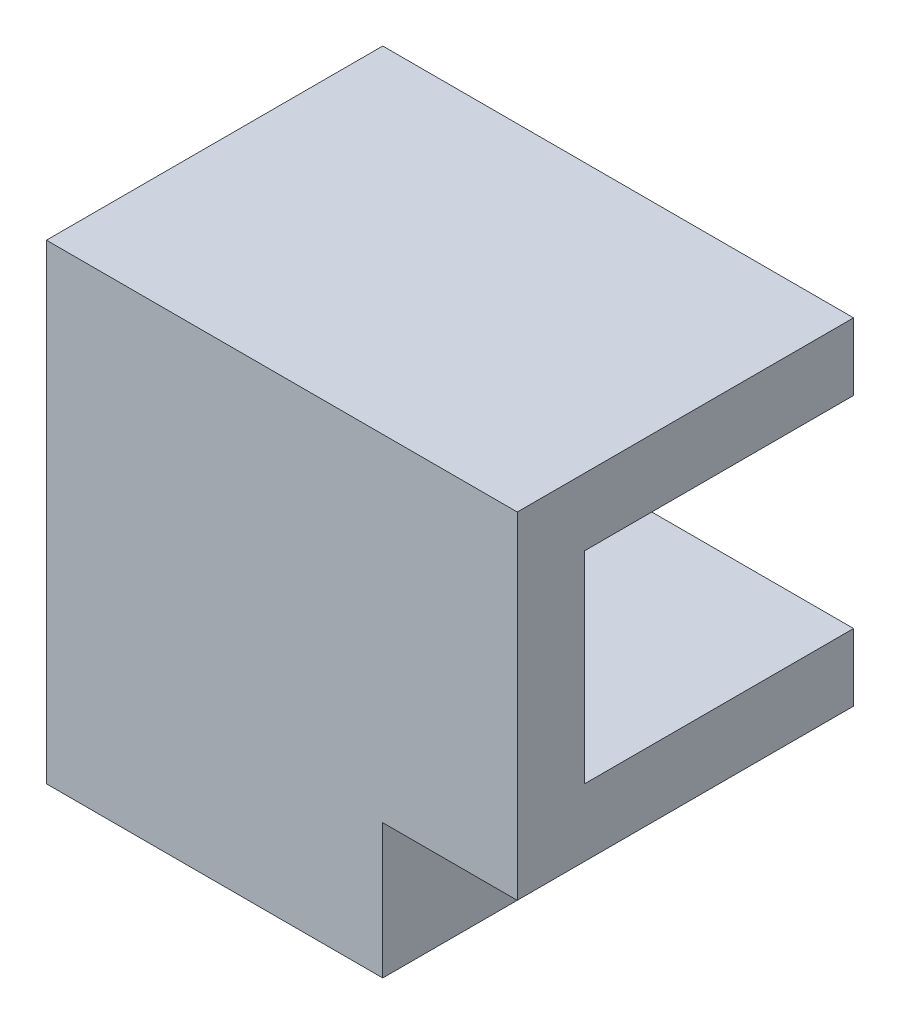
ISO-10303-21;
HEADER;
FILE_DESCRIPTION(('STEP AP214'),'2;1');
FILE_NAME('part.step','',(''),(''),'','','');
FILE_SCHEMA(('AUTOMOTIVE_DESIGN { 1 0 10303 214 1 1 1 1 }'));
ENDSEC;
DATA;
#1=APPLICATION_CONTEXT('core data for automotive mechanical design processes');
#2=APPLICATION_PROTOCOL_DEFINITION('international standard','automotive_design',2000,#1);
#3=PRODUCT_CONTEXT('',#1,'mechanical');
#4=PRODUCT('Part','Part','',(#3));
#5=PRODUCT_RELATED_PRODUCT_CATEGORY('part','',(#4));
#6=PRODUCT_DEFINITION_FORMATION('','',#4);
#7=PRODUCT_DEFINITION_CONTEXT('part definition',#1,'design');
#8=PRODUCT_DEFINITION('design','',#6,#7);
#9=PRODUCT_DEFINITION_SHAPE('','',#8);
#10=(LENGTH_UNIT() NAMED_UNIT(*) SI_UNIT(.MILLI.,.METRE.));
#11=(NAMED_UNIT(*) PLANE_ANGLE_UNIT() SI_UNIT($,.RADIAN.));
#12=(NAMED_UNIT(*) SI_UNIT($,.STERADIAN.) SOLID_ANGLE_UNIT());
#13=UNCERTAINTY_MEASURE_WITH_UNIT(LENGTH_MEASURE(1.E-05),#10,'distance_accuracy_value','');
#14=(GEOMETRIC_REPRESENTATION_CONTEXT(3) GLOBAL_UNCERTAINTY_ASSIGNED_CONTEXT((#13)) GLOBAL_UNIT_ASSIGNED_CONTEXT((#10,
#11,#12)) REPRESENTATION_CONTEXT('',''));
#15=CARTESIAN_POINT('',(0.,0.,0.));
#16=DIRECTION('',(0.,0.,1.));
#17=DIRECTION('',(1.,0.,0.));
#18=AXIS2_PLACEMENT_3D('',#15,#16,#17);
#19=CARTESIAN_POINT('',(0.,0.,0.));
#20=DIRECTION('',(0.,0.,1.));
#21=DIRECTION('',(1.,0.,0.));
#22=AXIS2_PLACEMENT_3D('',#19,#20,#21);
#23=PLANE('',#22);
#24=DIRECTION('',(0.,-1.,0.));
#25=VECTOR('',#24,1.);
#26=CARTESIAN_POINT('',(-2.317889251264,1.36643026004728,0.));
#27=LINE('',#26,#25);
#28=CARTESIAN_POINT('',(-2.317889251264,-1.63356973995272,0.));
#29=VERTEX_POINT('',#28);
#30=CARTESIAN_POINT('',(-2.317889251264,-4.63356973995272,0.));
#31=VERTEX_POINT('',#30);
#32=EDGE_CURVE('E174',#29,#31,#27,.T.);
#33=ORIENTED_EDGE('',*,*,#32,.F.);
#34=DIRECTION('',(1.,0.,0.));
#35=VECTOR('',#34,1.);
#36=CARTESIAN_POINT('',(-5.317889251264,-1.63356973995272,0.));
#37=LINE('',#36,#35);
#38=CARTESIAN_POINT('',(0.682110748736001,-1.63356973995272,0.));
#39=VERTEX_POINT('',#38);
#40=EDGE_CURVE('E184',#29,#39,#37,.T.);
#41=ORIENTED_EDGE('',*,*,#40,.T.);
#42=DIRECTION('',(0.,1.,0.));
#43=VECTOR('',#42,1.);
#44=CARTESIAN_POINT('',(0.682110748736001,2.36643026004728,0.));
#45=LINE('',#44,#43);
#46=CARTESIAN_POINT('',(0.682110748736002,-2.63356973995272,0.));
#47=VERTEX_POINT('',#46);
#48=EDGE_CURVE('E146',#47,#39,#45,.T.);
#49=ORIENTED_EDGE('',*,*,#48,.F.);
#50=DIRECTION('',(1.,0.,0.));
#51=VECTOR('',#50,1.);
#52=CARTESIAN_POINT('',(-1.317889251264,-2.63356973995272,0.));
#53=LINE('',#52,#51);
#54=CARTESIAN_POINT('',(-1.317889251264,-2.63356973995272,0.));
#55=VERTEX_POINT('',#54);
#56=EDGE_CURVE('E121',#55,#47,#53,.T.);
#57=ORIENTED_EDGE('',*,*,#56,.F.);
#58=DIRECTION('',(0.,1.,0.));
#59=VECTOR('',#58,1.);
#60=CARTESIAN_POINT('',(-1.317889251264,-4.63356973995272,0.));
#61=LINE('',#60,#59);
#62=CARTESIAN_POINT('',(-1.317889251264,-4.63356973995272,0.));
#63=VERTEX_POINT('',#62);
#64=EDGE_CURVE('E142',#63,#55,#61,.T.);
#65=ORIENTED_EDGE('',*,*,#64,.F.);
#66=DIRECTION('',(1.,0.,0.));
#67=VECTOR('',#66,1.);
#68=CARTESIAN_POINT('',(-6.317889251264,-4.63356973995272,0.));
#69=LINE('',#68,#67);
#70=EDGE_CURVE('E137',#31,#63,#69,.T.);
#71=ORIENTED_EDGE('',*,*,#70,.F.);
#72=EDGE_LOOP('',(#33,#41,#49,#57,#65,#71));
#73=FACE_BOUND('',#72,.T.);
#74=ADVANCED_FACE('F35',(#73),#23,.F.);
#75=CARTESIAN_POINT('',(-6.317889251264,2.36643026004728,5.));
#76=DIRECTION('',(1.,0.,0.));
#77=DIRECTION('',(0.,1.,0.));
#78=AXIS2_PLACEMENT_3D('',#75,#76,#77);
#79=PLANE('',#78);
#80=DIRECTION('',(0.,-1.,0.));
#81=VECTOR('',#80,1.);
#82=CARTESIAN_POINT('',(-6.317889251264,2.36643026004728,0.));
#83=LINE('',#82,#81);
#84=CARTESIAN_POINT('',(-6.317889251264,2.36643026004728,0.));
#85=VERTEX_POINT('',#84);
#86=CARTESIAN_POINT('',(-6.317889251264,-4.63356973995272,0.));
#87=VERTEX_POINT('',#86);
#88=EDGE_CURVE('E134',#85,#87,#83,.T.);
#89=ORIENTED_EDGE('',*,*,#88,.T.);
#90=DIRECTION('',(0.,0.,-1.));
#91=VECTOR('',#90,1.);
#92=CARTESIAN_POINT('',(-6.317889251264,-4.63356973995272,5.));
#93=LINE('',#92,#91);
#94=CARTESIAN_POINT('',(-6.317889251264,-4.63356973995272,5.));
#95=VERTEX_POINT('',#94);
#96=EDGE_CURVE('E43',#95,#87,#93,.T.);
#97=ORIENTED_EDGE('',*,*,#96,.F.);
#98=DIRECTION('',(0.,-1.,0.));
#99=VECTOR('',#98,1.);
#100=CARTESIAN_POINT('',(-6.317889251264,2.36643026004728,5.));
#101=LINE('',#100,#99);
#102=CARTESIAN_POINT('',(-6.317889251264,2.36643026004728,5.));
#103=VERTEX_POINT('',#102);
#104=EDGE_CURVE('E149',#103,#95,#101,.T.);
#105=ORIENTED_EDGE('',*,*,#104,.F.);
#106=DIRECTION('',(0.,0.,-1.));
#107=VECTOR('',#106,1.);
#108=CARTESIAN_POINT('',(-6.317889251264,2.36643026004728,5.));
#109=LINE('',#108,#107);
#110=EDGE_CURVE('E130',#103,#85,#109,.T.);
#111=ORIENTED_EDGE('',*,*,#110,.T.);
#112=EDGE_LOOP('',(#89,#97,#105,#111));
#113=FACE_BOUND('',#112,.T.);
#114=ADVANCED_FACE('F37',(#113),#79,.F.);
#115=CARTESIAN_POINT('',(-6.317889251264,-4.63356973995272,5.));
#116=DIRECTION('',(0.,1.,0.));
#117=DIRECTION('',(0.,0.,1.));
#118=AXIS2_PLACEMENT_3D('',#115,#116,#117);
#119=PLANE('',#118);
#120=CARTESIAN_POINT('',(-5.317889251264,-4.63356973995272,0.));
#121=VERTEX_POINT('',#120);
#122=EDGE_CURVE('E139',#87,#121,#69,.T.);
#123=ORIENTED_EDGE('',*,*,#122,.T.);
#124=DIRECTION('',(0.,0.,-1.));
#125=VECTOR('',#124,1.);
#126=CARTESIAN_POINT('',(-5.317889251264,-4.63356973995272,0.));
#127=LINE('',#126,#125);
#128=CARTESIAN_POINT('',(-5.317889251264,-4.63356973995272,4.));
#129=VERTEX_POINT('',#128);
#130=EDGE_CURVE('E178',#129,#121,#127,.T.);
#131=ORIENTED_EDGE('',*,*,#130,.F.);
#132=DIRECTION('',(-1.,0.,0.));
#133=VECTOR('',#132,1.);
#134=CARTESIAN_POINT('',(-5.317889251264,-4.63356973995272,4.));
#135=LINE('',#134,#133);
#136=CARTESIAN_POINT('',(-2.317889251264,-4.63356973995272,4.));
#137=VERTEX_POINT('',#136);
#138=EDGE_CURVE('E187',#137,#129,#135,.T.);
#139=ORIENTED_EDGE('',*,*,#138,.F.);
#140=DIRECTION('',(0.,0.,1.));
#141=VECTOR('',#140,1.);
#142=CARTESIAN_POINT('',(-2.317889251264,-4.63356973995272,0.));
#143=LINE('',#142,#141);
#144=EDGE_CURVE('E183',#31,#137,#143,.T.);
#145=ORIENTED_EDGE('',*,*,#144,.F.);
#146=ORIENTED_EDGE('',*,*,#70,.T.);
#147=DIRECTION('',(0.,0.,-1.));
#148=VECTOR('',#147,1.);
#149=CARTESIAN_POINT('',(-1.317889251264,-4.63356973995272,5.));
#150=LINE('',#149,#148);
#151=CARTESIAN_POINT('',(-1.317889251264,-4.63356973995272,5.));
#152=VERTEX_POINT('',#151);
#153=EDGE_CURVE('E153',#152,#63,#150,.T.);
#154=ORIENTED_EDGE('',*,*,#153,.F.);
#155=DIRECTION('',(1.,0.,0.));
#156=VECTOR('',#155,1.);
#157=CARTESIAN_POINT('',(-6.317889251264,-4.63356973995272,5.));
#158=LINE('',#157,#156);
#159=EDGE_CURVE('E95',#95,#152,#158,.T.);
#160=ORIENTED_EDGE('',*,*,#159,.F.);
#161=ORIENTED_EDGE('',*,*,#96,.T.);
#162=EDGE_LOOP('',(#123,#131,#139,#145,#146,#154,#160,#161));
#163=FACE_BOUND('',#162,.T.);
#164=ADVANCED_FACE('F156',(#163),#119,.F.);
#165=CARTESIAN_POINT('',(-1.317889251264,-4.63356973995272,5.));
#166=DIRECTION('',(-1.,0.,0.));
#167=DIRECTION('',(0.,0.,1.));
#168=AXIS2_PLACEMENT_3D('',#165,#166,#167);
#169=PLANE('',#168);
#170=ORIENTED_EDGE('',*,*,#64,.T.);
#171=DIRECTION('',(0.,0.,-1.));
#172=VECTOR('',#171,1.);
#173=CARTESIAN_POINT('',(-1.317889251264,-2.63356973995272,5.));
#174=LINE('',#173,#172);
#175=CARTESIAN_POINT('',(-1.317889251264,-2.63356973995272,5.));
#176=VERTEX_POINT('',#175);
#177=EDGE_CURVE('E125',#176,#55,#174,.T.);
#178=ORIENTED_EDGE('',*,*,#177,.F.);
#179=DIRECTION('',(0.,1.,0.));
#180=VECTOR('',#179,1.);
#181=CARTESIAN_POINT('',(-1.317889251264,-4.63356973995272,5.));
#182=LINE('',#181,#180);
#183=EDGE_CURVE('E112',#152,#176,#182,.T.);
#184=ORIENTED_EDGE('',*,*,#183,.F.);
#185=ORIENTED_EDGE('',*,*,#153,.T.);
#186=EDGE_LOOP('',(#170,#178,#184,#185));
#187=FACE_BOUND('',#186,.T.);
#188=ADVANCED_FACE('F207',(#187),#169,.F.);
#189=CARTESIAN_POINT('',(-1.317889251264,-2.63356973995272,5.));
#190=DIRECTION('',(0.,1.,0.));
#191=DIRECTION('',(0.,0.,1.));
#192=AXIS2_PLACEMENT_3D('',#189,#190,#191);
#193=PLANE('',#192);
#194=ORIENTED_EDGE('',*,*,#56,.T.);
#195=DIRECTION('',(0.,0.,-1.));
#196=VECTOR('',#195,1.);
#197=CARTESIAN_POINT('',(0.682110748736002,-2.63356973995272,5.));
#198=LINE('',#197,#196);
#199=CARTESIAN_POINT('',(0.682110748736002,-2.63356973995272,5.));
#200=VERTEX_POINT('',#199);
#201=EDGE_CURVE('E118',#200,#47,#198,.T.);
#202=ORIENTED_EDGE('',*,*,#201,.F.);
#203=DIRECTION('',(1.,0.,0.));
#204=VECTOR('',#203,1.);
#205=CARTESIAN_POINT('',(-1.317889251264,-2.63356973995272,5.));
#206=LINE('',#205,#204);
#207=EDGE_CURVE('E105',#176,#200,#206,.T.);
#208=ORIENTED_EDGE('',*,*,#207,.F.);
#209=ORIENTED_EDGE('',*,*,#177,.T.);
#210=EDGE_LOOP('',(#194,#202,#208,#209));
#211=FACE_BOUND('',#210,.T.);
#212=ADVANCED_FACE('F119',(#211),#193,.F.);
#213=CARTESIAN_POINT('',(0.682110748736001,2.36643026004728,5.));
#214=DIRECTION('',(-1.,0.,0.));
#215=DIRECTION('',(0.,-1.,0.));
#216=AXIS2_PLACEMENT_3D('',#213,#214,#215);
#217=PLANE('',#216);
#218=ORIENTED_EDGE('',*,*,#48,.T.);
#219=DIRECTION('',(0.,0.,-1.));
#220=VECTOR('',#219,1.);
#221=CARTESIAN_POINT('',(0.682110748736001,-1.63356973995272,0.));
#222=LINE('',#221,#220);
#223=CARTESIAN_POINT('',(0.682110748736001,-1.63356973995272,4.));
#224=VERTEX_POINT('',#223);
#225=EDGE_CURVE('E216',#224,#39,#222,.T.);
#226=ORIENTED_EDGE('',*,*,#225,.F.);
#227=DIRECTION('',(0.,-1.,0.));
#228=VECTOR('',#227,1.);
#229=CARTESIAN_POINT('',(0.682110748736001,1.36643026004728,4.));
#230=LINE('',#229,#228);
#231=CARTESIAN_POINT('',(0.682110748736001,1.36643026004728,4.));
#232=VERTEX_POINT('',#231);
#233=EDGE_CURVE('E240',#232,#224,#230,.T.);
#234=ORIENTED_EDGE('',*,*,#233,.F.);
#235=DIRECTION('',(0.,0.,1.));
#236=VECTOR('',#235,1.);
#237=CARTESIAN_POINT('',(0.682110748736001,1.36643026004728,0.));
#238=LINE('',#237,#236);
#239=CARTESIAN_POINT('',(0.682110748736001,1.36643026004728,0.));
#240=VERTEX_POINT('',#239);
#241=EDGE_CURVE('E243',#240,#232,#238,.T.);
#242=ORIENTED_EDGE('',*,*,#241,.F.);
#243=CARTESIAN_POINT('',(0.682110748736001,2.36643026004728,0.));
#244=VERTEX_POINT('',#243);
#245=EDGE_CURVE('E145',#240,#244,#45,.T.);
#246=ORIENTED_EDGE('',*,*,#245,.T.);
#247=DIRECTION('',(0.,0.,-1.));
#248=VECTOR('',#247,1.);
#249=CARTESIAN_POINT('',(0.682110748736001,2.36643026004728,5.));
#250=LINE('',#249,#248);
#251=CARTESIAN_POINT('',(0.682110748736001,2.36643026004728,5.));
#252=VERTEX_POINT('',#251);
#253=EDGE_CURVE('E126',#252,#244,#250,.T.);
#254=ORIENTED_EDGE('',*,*,#253,.F.);
#255=DIRECTION('',(0.,1.,0.));
#256=VECTOR('',#255,1.);
#257=CARTESIAN_POINT('',(0.682110748736001,2.36643026004728,5.));
#258=LINE('',#257,#256);
#259=EDGE_CURVE('E109',#200,#252,#258,.T.);
#260=ORIENTED_EDGE('',*,*,#259,.F.);
#261=ORIENTED_EDGE('',*,*,#201,.T.);
#262=EDGE_LOOP('',(#218,#226,#234,#242,#246,#254,#260,#261));
#263=FACE_BOUND('',#262,.T.);
#264=ADVANCED_FACE('F128',(#263),#217,.F.);
#265=CARTESIAN_POINT('',(-6.317889251264,2.36643026004728,5.));
#266=DIRECTION('',(0.,-1.,0.));
#267=DIRECTION('',(1.,0.,0.));
#268=AXIS2_PLACEMENT_3D('',#265,#266,#267);
#269=PLANE('',#268);
#270=DIRECTION('',(-1.,0.,0.));
#271=VECTOR('',#270,1.);
#272=CARTESIAN_POINT('',(-6.317889251264,2.36643026004728,0.));
#273=LINE('',#272,#271);
#274=EDGE_CURVE('E86',#244,#85,#273,.T.);
#275=ORIENTED_EDGE('',*,*,#274,.T.);
#276=ORIENTED_EDGE('',*,*,#110,.F.);
#277=DIRECTION('',(-1.,0.,0.));
#278=VECTOR('',#277,1.);
#279=CARTESIAN_POINT('',(-6.317889251264,2.36643026004728,5.));
#280=LINE('',#279,#278);
#281=EDGE_CURVE('E59',#252,#103,#280,.T.);
#282=ORIENTED_EDGE('',*,*,#281,.F.);
#283=ORIENTED_EDGE('',*,*,#253,.T.);
#284=EDGE_LOOP('',(#275,#276,#282,#283));
#285=FACE_BOUND('',#284,.T.);
#286=ADVANCED_FACE('F251',(#285),#269,.F.);
#287=CARTESIAN_POINT('',(0.,0.,5.));
#288=DIRECTION('',(0.,0.,1.));
#289=DIRECTION('',(1.,0.,0.));
#290=AXIS2_PLACEMENT_3D('',#287,#288,#289);
#291=PLANE('',#290);
#292=ORIENTED_EDGE('',*,*,#104,.T.);
#293=ORIENTED_EDGE('',*,*,#159,.T.);
#294=ORIENTED_EDGE('',*,*,#183,.T.);
#295=ORIENTED_EDGE('',*,*,#207,.T.);
#296=ORIENTED_EDGE('',*,*,#259,.T.);
#297=ORIENTED_EDGE('',*,*,#281,.T.);
#298=EDGE_LOOP('',(#292,#293,#294,#295,#296,#297));
#299=FACE_BOUND('',#298,.T.);
#300=ADVANCED_FACE('F107',(#299),#291,.T.);
#301=ORIENTED_EDGE('',*,*,#245,.F.);
#302=DIRECTION('',(1.,0.,0.));
#303=VECTOR('',#302,1.);
#304=CARTESIAN_POINT('',(-5.317889251264,1.36643026004728,0.));
#305=LINE('',#304,#303);
#306=CARTESIAN_POINT('',(-5.317889251264,1.36643026004728,0.));
#307=VERTEX_POINT('',#306);
#308=EDGE_CURVE('E169',#307,#240,#305,.T.);
#309=ORIENTED_EDGE('',*,*,#308,.F.);
#310=DIRECTION('',(0.,-1.,0.));
#311=VECTOR('',#310,1.);
#312=CARTESIAN_POINT('',(-5.317889251264,1.36643026004728,0.));
#313=LINE('',#312,#311);
#314=EDGE_CURVE('E167',#307,#121,#313,.T.);
#315=ORIENTED_EDGE('',*,*,#314,.T.);
#316=ORIENTED_EDGE('',*,*,#122,.F.);
#317=ORIENTED_EDGE('',*,*,#88,.F.);
#318=ORIENTED_EDGE('',*,*,#274,.F.);
#319=EDGE_LOOP('',(#301,#309,#315,#316,#317,#318));
#320=FACE_BOUND('',#319,.T.);
#321=ADVANCED_FACE('F164',(#320),#23,.F.);
#322=CARTESIAN_POINT('',(-5.317889251264,1.36643026004728,0.));
#323=DIRECTION('',(-1.,0.,0.));
#324=DIRECTION('',(0.,0.,1.));
#325=AXIS2_PLACEMENT_3D('',#322,#323,#324);
#326=PLANE('',#325);
#327=ORIENTED_EDGE('',*,*,#130,.T.);
#328=ORIENTED_EDGE('',*,*,#314,.F.);
#329=DIRECTION('',(0.,0.,-1.));
#330=VECTOR('',#329,1.);
#331=CARTESIAN_POINT('',(-5.317889251264,1.36643026004728,0.));
#332=LINE('',#331,#330);
#333=CARTESIAN_POINT('',(-5.317889251264,1.36643026004728,4.));
#334=VERTEX_POINT('',#333);
#335=EDGE_CURVE('E50',#334,#307,#332,.T.);
#336=ORIENTED_EDGE('',*,*,#335,.F.);
#337=DIRECTION('',(0.,-1.,0.));
#338=VECTOR('',#337,1.);
#339=CARTESIAN_POINT('',(-5.317889251264,1.36643026004728,4.));
#340=LINE('',#339,#338);
#341=EDGE_CURVE('E138',#334,#129,#340,.T.);
#342=ORIENTED_EDGE('',*,*,#341,.T.);
#343=EDGE_LOOP('',(#327,#328,#336,#342));
#344=FACE_BOUND('',#343,.T.);
#345=ADVANCED_FACE('F179',(#344),#326,.F.);
#346=CARTESIAN_POINT('',(-5.317889251264,1.36643026004728,4.));
#347=DIRECTION('',(0.,0.,1.));
#348=DIRECTION('',(1.,0.,0.));
#349=AXIS2_PLACEMENT_3D('',#346,#347,#348);
#350=PLANE('',#349);
#351=ORIENTED_EDGE('',*,*,#138,.T.);
#352=ORIENTED_EDGE('',*,*,#341,.F.);
#353=DIRECTION('',(-1.,0.,0.));
#354=VECTOR('',#353,1.);
#355=CARTESIAN_POINT('',(-5.317889251264,1.36643026004728,4.));
#356=LINE('',#355,#354);
#357=EDGE_CURVE('E175',#232,#334,#356,.T.);
#358=ORIENTED_EDGE('',*,*,#357,.F.);
#359=ORIENTED_EDGE('',*,*,#233,.T.);
#360=DIRECTION('',(1.,0.,0.));
#361=VECTOR('',#360,1.);
#362=CARTESIAN_POINT('',(-5.317889251264,-1.63356973995272,4.));
#363=LINE('',#362,#361);
#364=CARTESIAN_POINT('',(-2.317889251264,-1.63356973995272,4.));
#365=VERTEX_POINT('',#364);
#366=EDGE_CURVE('E190',#365,#224,#363,.T.);
#367=ORIENTED_EDGE('',*,*,#366,.F.);
#368=DIRECTION('',(0.,-1.,0.));
#369=VECTOR('',#368,1.);
#370=CARTESIAN_POINT('',(-2.317889251264,1.36643026004728,4.));
#371=LINE('',#370,#369);
#372=EDGE_CURVE('E197',#365,#137,#371,.T.);
#373=ORIENTED_EDGE('',*,*,#372,.T.);
#374=EDGE_LOOP('',(#351,#352,#358,#359,#367,#373));
#375=FACE_BOUND('',#374,.T.);
#376=ADVANCED_FACE('F233',(#375),#350,.F.);
#377=CARTESIAN_POINT('',(-2.317889251264,1.36643026004728,0.));
#378=DIRECTION('',(1.,0.,0.));
#379=DIRECTION('',(0.,0.,-1.));
#380=AXIS2_PLACEMENT_3D('',#377,#378,#379);
#381=PLANE('',#380);
#382=ORIENTED_EDGE('',*,*,#372,.F.);
#383=DIRECTION('',(0.,0.,-1.));
#384=VECTOR('',#383,1.);
#385=CARTESIAN_POINT('',(-2.317889251264,-1.63356973995272,0.));
#386=LINE('',#385,#384);
#387=EDGE_CURVE('E11',#365,#29,#386,.T.);
#388=ORIENTED_EDGE('',*,*,#387,.T.);
#389=ORIENTED_EDGE('',*,*,#32,.T.);
#390=ORIENTED_EDGE('',*,*,#144,.T.);
#391=EDGE_LOOP('',(#382,#388,#389,#390));
#392=FACE_BOUND('',#391,.T.);
#393=ADVANCED_FACE('F236',(#392),#381,.F.);
#394=CARTESIAN_POINT('',(0.,1.36643026004728,0.));
#395=DIRECTION('',(0.,1.,0.));
#396=DIRECTION('',(0.,0.,1.));
#397=AXIS2_PLACEMENT_3D('',#394,#395,#396);
#398=PLANE('',#397);
#399=ORIENTED_EDGE('',*,*,#335,.T.);
#400=ORIENTED_EDGE('',*,*,#308,.T.);
#401=ORIENTED_EDGE('',*,*,#241,.T.);
#402=ORIENTED_EDGE('',*,*,#357,.T.);
#403=EDGE_LOOP('',(#399,#400,#401,#402));
#404=FACE_BOUND('',#403,.T.);
#405=ADVANCED_FACE('F249',(#404),#398,.F.);
#406=CARTESIAN_POINT('',(-5.317889251264,-1.63356973995272,0.));
#407=DIRECTION('',(0.,-1.,0.));
#408=DIRECTION('',(1.,0.,0.));
#409=AXIS2_PLACEMENT_3D('',#406,#407,#408);
#410=PLANE('',#409);
#411=ORIENTED_EDGE('',*,*,#366,.T.);
#412=ORIENTED_EDGE('',*,*,#225,.T.);
#413=ORIENTED_EDGE('',*,*,#40,.F.);
#414=ORIENTED_EDGE('',*,*,#387,.F.);
#415=EDGE_LOOP('',(#411,#412,#413,#414));
#416=FACE_BOUND('',#415,.T.);
#417=ADVANCED_FACE('F237',(#416),#410,.F.);
#418=CLOSED_SHELL('',(#74,#114,#164,#188,#212,#264,#286,#300,#321,#345,#376,#393,#405,#417));
#419=MANIFOLD_SOLID_BREP('B2',#418);
#420=ADVANCED_BREP_SHAPE_REPRESENTATION('',(#18,#419),#14);
#421=SHAPE_DEFINITION_REPRESENTATION(#9,#420);
ENDSEC;
END-ISO-10303-21;
